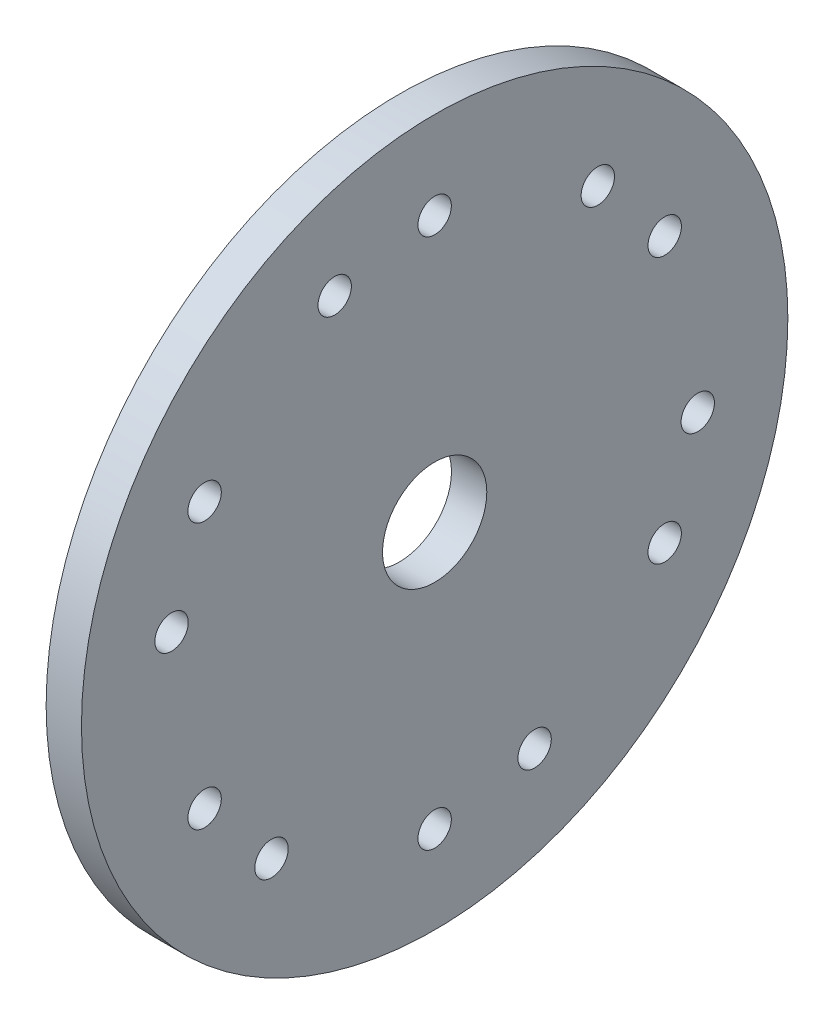
ISO-10303-21;
HEADER;
FILE_DESCRIPTION(('STEP AP214'),'2;1');
FILE_NAME('part.step','',(''),(''),'','','');
FILE_SCHEMA(('AUTOMOTIVE_DESIGN { 1 0 10303 214 1 1 1 1 }'));
ENDSEC;
DATA;
#1=APPLICATION_CONTEXT('core data for automotive mechanical design processes');
#2=APPLICATION_PROTOCOL_DEFINITION('international standard','automotive_design',2000,#1);
#3=PRODUCT_CONTEXT('',#1,'mechanical');
#4=PRODUCT('Part','Part','',(#3));
#5=PRODUCT_RELATED_PRODUCT_CATEGORY('part','',(#4));
#6=PRODUCT_DEFINITION_FORMATION('','',#4);
#7=PRODUCT_DEFINITION_CONTEXT('part definition',#1,'design');
#8=PRODUCT_DEFINITION('design','',#6,#7);
#9=PRODUCT_DEFINITION_SHAPE('','',#8);
#10=(LENGTH_UNIT() NAMED_UNIT(*) SI_UNIT(.MILLI.,.METRE.));
#11=(NAMED_UNIT(*) PLANE_ANGLE_UNIT() SI_UNIT($,.RADIAN.));
#12=(NAMED_UNIT(*) SI_UNIT($,.STERADIAN.) SOLID_ANGLE_UNIT());
#13=UNCERTAINTY_MEASURE_WITH_UNIT(LENGTH_MEASURE(1.E-05),#10,'distance_accuracy_value','');
#14=(GEOMETRIC_REPRESENTATION_CONTEXT(3) GLOBAL_UNCERTAINTY_ASSIGNED_CONTEXT((#13)) GLOBAL_UNIT_ASSIGNED_CONTEXT((#10,
#11,#12)) REPRESENTATION_CONTEXT('',''));
#15=CARTESIAN_POINT('',(0.,0.,0.));
#16=DIRECTION('',(0.,0.,1.));
#17=DIRECTION('',(1.,0.,0.));
#18=AXIS2_PLACEMENT_3D('',#15,#16,#17);
#19=CARTESIAN_POINT('',(3.40414777600784,51.1989186374219,0.));
#20=DIRECTION('',(-1.,0.,0.));
#21=DIRECTION('',(0.,0.,1.));
#22=AXIS2_PLACEMENT_3D('',#19,#20,#21);
#23=CYLINDRICAL_SURFACE('',#22,3.21651758362946);
#24=CARTESIAN_POINT('',(3.40414777600784,51.1989186374219,0.));
#25=DIRECTION('',(1.,0.,0.));
#26=DIRECTION('',(0.,0.,-1.));
#27=AXIS2_PLACEMENT_3D('',#24,#25,#26);
#28=CIRCLE('',#27,3.21651758362946);
#29=CARTESIAN_POINT('',(3.40414777600784,51.1989186374219,-3.21651758362946));
#30=VERTEX_POINT('',#29);
#31=EDGE_CURVE('E57',#30,#30,#28,.T.);
#32=ORIENTED_EDGE('',*,*,#31,.T.);
#33=EDGE_LOOP('',(#32));
#34=FACE_BOUND('',#33,.T.);
#35=CARTESIAN_POINT('',(-3.40414777600784,51.1989186374219,0.));
#36=DIRECTION('',(1.,0.,0.));
#37=DIRECTION('',(0.,0.,-1.));
#38=AXIS2_PLACEMENT_3D('',#35,#36,#37);
#39=CIRCLE('',#38,3.21651758362946);
#40=CARTESIAN_POINT('',(-3.40414777600784,51.1989186374219,-3.21651758362946));
#41=VERTEX_POINT('',#40);
#42=EDGE_CURVE('E99',#41,#41,#39,.T.);
#43=ORIENTED_EDGE('',*,*,#42,.F.);
#44=EDGE_LOOP('',(#43));
#45=FACE_BOUND('',#44,.T.);
#46=ADVANCED_FACE('F49',(#34,#45),#23,.F.);
#47=CARTESIAN_POINT('',(3.40414777600784,40.4044126332726,-31.4453924987682));
#48=DIRECTION('',(-1.,0.,0.));
#49=DIRECTION('',(0.,0.,1.));
#50=AXIS2_PLACEMENT_3D('',#47,#48,#49);
#51=CYLINDRICAL_SURFACE('',#50,3.21651758362946);
#52=CARTESIAN_POINT('',(3.40414777600784,40.4044126332726,-31.4453924987682));
#53=DIRECTION('',(1.,0.,0.));
#54=DIRECTION('',(0.,0.,-1.));
#55=AXIS2_PLACEMENT_3D('',#52,#53,#54);
#56=CIRCLE('',#55,3.21651758362946);
#57=CARTESIAN_POINT('',(3.40414777600784,40.4044126332726,-34.6619100823976));
#58=VERTEX_POINT('',#57);
#59=EDGE_CURVE('E62',#58,#58,#56,.T.);
#60=ORIENTED_EDGE('',*,*,#59,.T.);
#61=EDGE_LOOP('',(#60));
#62=FACE_BOUND('',#61,.T.);
#63=CARTESIAN_POINT('',(-3.40414777600784,40.4044126332726,-31.4453924987682));
#64=DIRECTION('',(1.,0.,0.));
#65=DIRECTION('',(0.,0.,-1.));
#66=AXIS2_PLACEMENT_3D('',#63,#64,#65);
#67=CIRCLE('',#66,3.21651758362946);
#68=CARTESIAN_POINT('',(-3.40414777600784,40.4044126332726,-34.6619100823976));
#69=VERTEX_POINT('',#68);
#70=EDGE_CURVE('E97',#69,#69,#67,.T.);
#71=ORIENTED_EDGE('',*,*,#70,.F.);
#72=EDGE_LOOP('',(#71));
#73=FACE_BOUND('',#72,.T.);
#74=ADVANCED_FACE('F143',(#62,#73),#51,.F.);
#75=CARTESIAN_POINT('',(3.40414777600784,-7.03030241926968,-50.7139440147871));
#76=DIRECTION('',(-1.,0.,0.));
#77=DIRECTION('',(0.,0.,1.));
#78=AXIS2_PLACEMENT_3D('',#75,#76,#77);
#79=CYLINDRICAL_SURFACE('',#78,3.21651758362945);
#80=CARTESIAN_POINT('',(3.40414777600784,-7.03030241926968,-50.7139440147871));
#81=DIRECTION('',(1.,0.,0.));
#82=DIRECTION('',(0.,0.,-1.));
#83=AXIS2_PLACEMENT_3D('',#80,#81,#82);
#84=CIRCLE('',#83,3.21651758362945);
#85=CARTESIAN_POINT('',(3.40414777600784,-7.03030241926968,-53.9304615984165));
#86=VERTEX_POINT('',#85);
#87=EDGE_CURVE('E138',#86,#86,#84,.T.);
#88=ORIENTED_EDGE('',*,*,#87,.T.);
#89=EDGE_LOOP('',(#88));
#90=FACE_BOUND('',#89,.T.);
#91=CARTESIAN_POINT('',(-3.40414777600784,-7.03030241926968,-50.7139440147871));
#92=DIRECTION('',(1.,0.,0.));
#93=DIRECTION('',(0.,0.,-1.));
#94=AXIS2_PLACEMENT_3D('',#91,#92,#93);
#95=CIRCLE('',#94,3.21651758362945);
#96=CARTESIAN_POINT('',(-3.40414777600784,-7.03030241926968,-53.9304615984165));
#97=VERTEX_POINT('',#96);
#98=EDGE_CURVE('E94',#97,#97,#95,.T.);
#99=ORIENTED_EDGE('',*,*,#98,.F.);
#100=EDGE_LOOP('',(#99));
#101=FACE_BOUND('',#100,.T.);
#102=ADVANCED_FACE('F179',(#90,#101),#79,.F.);
#103=CARTESIAN_POINT('',(3.40414777600784,25.5994593187108,-44.3395641863));
#104=DIRECTION('',(-1.,0.,0.));
#105=DIRECTION('',(0.,0.,1.));
#106=AXIS2_PLACEMENT_3D('',#103,#104,#105);
#107=CYLINDRICAL_SURFACE('',#106,3.21651758362946);
#108=CARTESIAN_POINT('',(3.40414777600784,25.5994593187108,-44.3395641863));
#109=DIRECTION('',(1.,0.,0.));
#110=DIRECTION('',(0.,0.,-1.));
#111=AXIS2_PLACEMENT_3D('',#108,#109,#110);
#112=CIRCLE('',#111,3.21651758362946);
#113=CARTESIAN_POINT('',(3.40414777600784,25.5994593187108,-47.5560817699294));
#114=VERTEX_POINT('',#113);
#115=EDGE_CURVE('E135',#114,#114,#112,.T.);
#116=ORIENTED_EDGE('',*,*,#115,.T.);
#117=EDGE_LOOP('',(#116));
#118=FACE_BOUND('',#117,.T.);
#119=CARTESIAN_POINT('',(-3.40414777600784,25.5994593187108,-44.3395641863));
#120=DIRECTION('',(1.,0.,0.));
#121=DIRECTION('',(0.,0.,-1.));
#122=AXIS2_PLACEMENT_3D('',#119,#120,#121);
#123=CIRCLE('',#122,3.21651758362946);
#124=CARTESIAN_POINT('',(-3.40414777600784,25.5994593187108,-47.5560817699294));
#125=VERTEX_POINT('',#124);
#126=EDGE_CURVE('E91',#125,#125,#123,.T.);
#127=ORIENTED_EDGE('',*,*,#126,.F.);
#128=EDGE_LOOP('',(#127));
#129=FACE_BOUND('',#128,.T.);
#130=ADVANCED_FACE('F185',(#118,#129),#107,.F.);
#131=CARTESIAN_POINT('',(3.40414777600784,-47.4347150525423,-19.2685515160187));
#132=DIRECTION('',(-1.,0.,0.));
#133=DIRECTION('',(0.,0.,1.));
#134=AXIS2_PLACEMENT_3D('',#131,#132,#133);
#135=CYLINDRICAL_SURFACE('',#134,3.21651758362946);
#136=CARTESIAN_POINT('',(3.40414777600784,-47.4347150525423,-19.2685515160187));
#137=DIRECTION('',(1.,0.,0.));
#138=DIRECTION('',(0.,0.,-1.));
#139=AXIS2_PLACEMENT_3D('',#136,#137,#138);
#140=CIRCLE('',#139,3.21651758362946);
#141=CARTESIAN_POINT('',(3.40414777600784,-47.4347150525423,-22.4850690996481));
#142=VERTEX_POINT('',#141);
#143=EDGE_CURVE('E132',#142,#142,#140,.T.);
#144=ORIENTED_EDGE('',*,*,#143,.T.);
#145=EDGE_LOOP('',(#144));
#146=FACE_BOUND('',#145,.T.);
#147=CARTESIAN_POINT('',(-3.40414777600784,-47.4347150525423,-19.2685515160187));
#148=DIRECTION('',(1.,0.,0.));
#149=DIRECTION('',(0.,0.,-1.));
#150=AXIS2_PLACEMENT_3D('',#147,#148,#149);
#151=CIRCLE('',#150,3.21651758362946);
#152=CARTESIAN_POINT('',(-3.40414777600784,-47.4347150525423,-22.4850690996481));
#153=VERTEX_POINT('',#152);
#154=EDGE_CURVE('E88',#153,#153,#151,.T.);
#155=ORIENTED_EDGE('',*,*,#154,.F.);
#156=EDGE_LOOP('',(#155));
#157=FACE_BOUND('',#156,.T.);
#158=ADVANCED_FACE('F189',(#146,#157),#135,.F.);
#159=CARTESIAN_POINT('',(3.40414777600784,-25.5994593187111,-44.3395641862998));
#160=DIRECTION('',(-1.,0.,0.));
#161=DIRECTION('',(0.,0.,1.));
#162=AXIS2_PLACEMENT_3D('',#159,#160,#161);
#163=CYLINDRICAL_SURFACE('',#162,3.21651758362946);
#164=CARTESIAN_POINT('',(3.40414777600784,-25.5994593187111,-44.3395641862998));
#165=DIRECTION('',(1.,0.,0.));
#166=DIRECTION('',(0.,0.,-1.));
#167=AXIS2_PLACEMENT_3D('',#164,#165,#166);
#168=CIRCLE('',#167,3.21651758362946);
#169=CARTESIAN_POINT('',(3.40414777600784,-25.5994593187111,-47.5560817699292));
#170=VERTEX_POINT('',#169);
#171=EDGE_CURVE('E129',#170,#170,#168,.T.);
#172=ORIENTED_EDGE('',*,*,#171,.T.);
#173=EDGE_LOOP('',(#172));
#174=FACE_BOUND('',#173,.T.);
#175=CARTESIAN_POINT('',(-3.40414777600784,-25.5994593187111,-44.3395641862998));
#176=DIRECTION('',(1.,0.,0.));
#177=DIRECTION('',(0.,0.,-1.));
#178=AXIS2_PLACEMENT_3D('',#175,#176,#177);
#179=CIRCLE('',#178,3.21651758362946);
#180=CARTESIAN_POINT('',(-3.40414777600784,-25.5994593187111,-47.5560817699292));
#181=VERTEX_POINT('',#180);
#182=EDGE_CURVE('E85',#181,#181,#179,.T.);
#183=ORIENTED_EDGE('',*,*,#182,.F.);
#184=EDGE_LOOP('',(#183));
#185=FACE_BOUND('',#184,.T.);
#186=ADVANCED_FACE('F193',(#174,#185),#163,.F.);
#187=CARTESIAN_POINT('',(3.40414777600784,-40.4044126332724,31.4453924987685));
#188=DIRECTION('',(-1.,0.,0.));
#189=DIRECTION('',(0.,0.,1.));
#190=AXIS2_PLACEMENT_3D('',#187,#188,#189);
#191=CYLINDRICAL_SURFACE('',#190,3.21651758362946);
#192=CARTESIAN_POINT('',(3.40414777600784,-40.4044126332724,31.4453924987685));
#193=DIRECTION('',(1.,0.,0.));
#194=DIRECTION('',(0.,0.,-1.));
#195=AXIS2_PLACEMENT_3D('',#192,#193,#194);
#196=CIRCLE('',#195,3.21651758362946);
#197=CARTESIAN_POINT('',(3.40414777600784,-40.4044126332724,28.228874915139));
#198=VERTEX_POINT('',#197);
#199=EDGE_CURVE('E126',#198,#198,#196,.T.);
#200=ORIENTED_EDGE('',*,*,#199,.T.);
#201=EDGE_LOOP('',(#200));
#202=FACE_BOUND('',#201,.T.);
#203=CARTESIAN_POINT('',(-3.40414777600784,-40.4044126332724,31.4453924987685));
#204=DIRECTION('',(1.,0.,0.));
#205=DIRECTION('',(0.,0.,-1.));
#206=AXIS2_PLACEMENT_3D('',#203,#204,#205);
#207=CIRCLE('',#206,3.21651758362946);
#208=CARTESIAN_POINT('',(-3.40414777600784,-40.4044126332724,28.228874915139));
#209=VERTEX_POINT('',#208);
#210=EDGE_CURVE('E82',#209,#209,#207,.T.);
#211=ORIENTED_EDGE('',*,*,#210,.F.);
#212=EDGE_LOOP('',(#211));
#213=FACE_BOUND('',#212,.T.);
#214=ADVANCED_FACE('F197',(#202,#213),#191,.F.);
#215=CARTESIAN_POINT('',(3.40414777600784,-51.1989186374219,3.57520137983013E-13));
#216=DIRECTION('',(-1.,0.,0.));
#217=DIRECTION('',(0.,0.,1.));
#218=AXIS2_PLACEMENT_3D('',#215,#216,#217);
#219=CYLINDRICAL_SURFACE('',#218,3.21651758362946);
#220=CARTESIAN_POINT('',(3.40414777600784,-51.1989186374219,3.57520137983013E-13));
#221=DIRECTION('',(1.,0.,0.));
#222=DIRECTION('',(0.,0.,-1.));
#223=AXIS2_PLACEMENT_3D('',#220,#221,#222);
#224=CIRCLE('',#223,3.21651758362946);
#225=CARTESIAN_POINT('',(3.40414777600784,-51.1989186374219,-3.2165175836291));
#226=VERTEX_POINT('',#225);
#227=EDGE_CURVE('E123',#226,#226,#224,.T.);
#228=ORIENTED_EDGE('',*,*,#227,.T.);
#229=EDGE_LOOP('',(#228));
#230=FACE_BOUND('',#229,.T.);
#231=CARTESIAN_POINT('',(-3.40414777600784,-51.1989186374219,3.57520137983013E-13));
#232=DIRECTION('',(1.,0.,0.));
#233=DIRECTION('',(0.,0.,-1.));
#234=AXIS2_PLACEMENT_3D('',#231,#232,#233);
#235=CIRCLE('',#234,3.21651758362946);
#236=CARTESIAN_POINT('',(-3.40414777600784,-51.1989186374219,-3.2165175836291));
#237=VERTEX_POINT('',#236);
#238=EDGE_CURVE('E79',#237,#237,#235,.T.);
#239=ORIENTED_EDGE('',*,*,#238,.F.);
#240=EDGE_LOOP('',(#239));
#241=FACE_BOUND('',#240,.T.);
#242=ADVANCED_FACE('F201',(#230,#241),#219,.F.);
#243=CARTESIAN_POINT('',(3.40414777600784,7.03030241927002,50.713944014787));
#244=DIRECTION('',(-1.,0.,0.));
#245=DIRECTION('',(0.,0.,1.));
#246=AXIS2_PLACEMENT_3D('',#243,#244,#245);
#247=CYLINDRICAL_SURFACE('',#246,3.21651758362946);
#248=CARTESIAN_POINT('',(3.40414777600784,7.03030241927002,50.713944014787));
#249=DIRECTION('',(1.,0.,0.));
#250=DIRECTION('',(0.,0.,-1.));
#251=AXIS2_PLACEMENT_3D('',#248,#249,#250);
#252=CIRCLE('',#251,3.21651758362946);
#253=CARTESIAN_POINT('',(3.40414777600784,7.03030241927002,47.4974264311575));
#254=VERTEX_POINT('',#253);
#255=EDGE_CURVE('E120',#254,#254,#252,.T.);
#256=ORIENTED_EDGE('',*,*,#255,.T.);
#257=EDGE_LOOP('',(#256));
#258=FACE_BOUND('',#257,.T.);
#259=CARTESIAN_POINT('',(-3.40414777600784,7.03030241927002,50.713944014787));
#260=DIRECTION('',(1.,0.,0.));
#261=DIRECTION('',(0.,0.,-1.));
#262=AXIS2_PLACEMENT_3D('',#259,#260,#261);
#263=CIRCLE('',#262,3.21651758362946);
#264=CARTESIAN_POINT('',(-3.40414777600784,7.03030241927002,47.4974264311575));
#265=VERTEX_POINT('',#264);
#266=EDGE_CURVE('E76',#265,#265,#263,.T.);
#267=ORIENTED_EDGE('',*,*,#266,.F.);
#268=EDGE_LOOP('',(#267));
#269=FACE_BOUND('',#268,.T.);
#270=ADVANCED_FACE('F205',(#258,#269),#247,.F.);
#271=CARTESIAN_POINT('',(3.40414777600784,-25.5994593187105,44.3395641863001));
#272=DIRECTION('',(-1.,0.,0.));
#273=DIRECTION('',(0.,0.,1.));
#274=AXIS2_PLACEMENT_3D('',#271,#272,#273);
#275=CYLINDRICAL_SURFACE('',#274,3.21651758362946);
#276=CARTESIAN_POINT('',(3.40414777600784,-25.5994593187105,44.3395641863001));
#277=DIRECTION('',(1.,0.,0.));
#278=DIRECTION('',(0.,0.,-1.));
#279=AXIS2_PLACEMENT_3D('',#276,#277,#278);
#280=CIRCLE('',#279,3.21651758362946);
#281=CARTESIAN_POINT('',(3.40414777600784,-25.5994593187105,41.1230466026707));
#282=VERTEX_POINT('',#281);
#283=EDGE_CURVE('E113',#282,#282,#280,.T.);
#284=ORIENTED_EDGE('',*,*,#283,.T.);
#285=EDGE_LOOP('',(#284));
#286=FACE_BOUND('',#285,.T.);
#287=CARTESIAN_POINT('',(-3.40414777600784,-25.5994593187105,44.3395641863001));
#288=DIRECTION('',(1.,0.,0.));
#289=DIRECTION('',(0.,0.,-1.));
#290=AXIS2_PLACEMENT_3D('',#287,#288,#289);
#291=CIRCLE('',#290,3.21651758362946);
#292=CARTESIAN_POINT('',(-3.40414777600784,-25.5994593187105,41.1230466026707));
#293=VERTEX_POINT('',#292);
#294=EDGE_CURVE('E73',#293,#293,#291,.T.);
#295=ORIENTED_EDGE('',*,*,#294,.F.);
#296=EDGE_LOOP('',(#295));
#297=FACE_BOUND('',#296,.T.);
#298=ADVANCED_FACE('F209',(#286,#297),#275,.F.);
#299=CARTESIAN_POINT('',(3.40414777600784,47.4347150525424,19.2685515160184));
#300=DIRECTION('',(-1.,0.,0.));
#301=DIRECTION('',(0.,0.,1.));
#302=AXIS2_PLACEMENT_3D('',#299,#300,#301);
#303=CYLINDRICAL_SURFACE('',#302,3.21651758362945);
#304=CARTESIAN_POINT('',(3.40414777600784,47.4347150525424,19.2685515160184));
#305=DIRECTION('',(1.,0.,0.));
#306=DIRECTION('',(0.,0.,-1.));
#307=AXIS2_PLACEMENT_3D('',#304,#305,#306);
#308=CIRCLE('',#307,3.21651758362945);
#309=CARTESIAN_POINT('',(3.40414777600784,47.4347150525424,16.0520339323889));
#310=VERTEX_POINT('',#309);
#311=EDGE_CURVE('E108',#310,#310,#308,.T.);
#312=ORIENTED_EDGE('',*,*,#311,.T.);
#313=EDGE_LOOP('',(#312));
#314=FACE_BOUND('',#313,.T.);
#315=CARTESIAN_POINT('',(-3.40414777600784,47.4347150525424,19.2685515160184));
#316=DIRECTION('',(1.,0.,0.));
#317=DIRECTION('',(0.,0.,-1.));
#318=AXIS2_PLACEMENT_3D('',#315,#316,#317);
#319=CIRCLE('',#318,3.21651758362945);
#320=CARTESIAN_POINT('',(-3.40414777600784,47.4347150525424,16.0520339323889));
#321=VERTEX_POINT('',#320);
#322=EDGE_CURVE('E69',#321,#321,#319,.T.);
#323=ORIENTED_EDGE('',*,*,#322,.F.);
#324=EDGE_LOOP('',(#323));
#325=FACE_BOUND('',#324,.T.);
#326=ADVANCED_FACE('F212',(#314,#325),#303,.F.);
#327=CARTESIAN_POINT('',(3.40414777600784,25.5994593187115,44.3395641862996));
#328=DIRECTION('',(-1.,0.,0.));
#329=DIRECTION('',(0.,0.,1.));
#330=AXIS2_PLACEMENT_3D('',#327,#328,#329);
#331=CYLINDRICAL_SURFACE('',#330,3.21651758362946);
#332=CARTESIAN_POINT('',(3.40414777600784,25.5994593187115,44.3395641862996));
#333=DIRECTION('',(1.,0.,0.));
#334=DIRECTION('',(0.,0.,-1.));
#335=AXIS2_PLACEMENT_3D('',#332,#333,#334);
#336=CIRCLE('',#335,3.21651758362946);
#337=CARTESIAN_POINT('',(3.40414777600784,25.5994593187115,41.1230466026701));
#338=VERTEX_POINT('',#337);
#339=EDGE_CURVE('E104',#338,#338,#336,.T.);
#340=ORIENTED_EDGE('',*,*,#339,.T.);
#341=EDGE_LOOP('',(#340));
#342=FACE_BOUND('',#341,.T.);
#343=CARTESIAN_POINT('',(-3.40414777600784,25.5994593187115,44.3395641862996));
#344=DIRECTION('',(1.,0.,0.));
#345=DIRECTION('',(0.,0.,-1.));
#346=AXIS2_PLACEMENT_3D('',#343,#344,#345);
#347=CIRCLE('',#346,3.21651758362946);
#348=CARTESIAN_POINT('',(-3.40414777600784,25.5994593187115,41.1230466026701));
#349=VERTEX_POINT('',#348);
#350=EDGE_CURVE('E66',#349,#349,#347,.T.);
#351=ORIENTED_EDGE('',*,*,#350,.F.);
#352=EDGE_LOOP('',(#351));
#353=FACE_BOUND('',#352,.T.);
#354=ADVANCED_FACE('F51',(#342,#353),#331,.F.);
#355=CARTESIAN_POINT('',(3.40414777600784,0.,0.));
#356=DIRECTION('',(-1.,0.,0.));
#357=DIRECTION('',(0.,0.,1.));
#358=AXIS2_PLACEMENT_3D('',#355,#356,#357);
#359=CYLINDRICAL_SURFACE('',#358,68.0829555201568);
#360=CARTESIAN_POINT('',(3.40414777600784,0.,0.));
#361=DIRECTION('',(1.,0.,0.));
#362=DIRECTION('',(0.,0.,-1.));
#363=AXIS2_PLACEMENT_3D('',#360,#361,#362);
#364=CIRCLE('',#363,68.0829555201568);
#365=CARTESIAN_POINT('',(3.40414777600784,0.,-68.0829555201568));
#366=VERTEX_POINT('',#365);
#367=EDGE_CURVE('E10',#366,#366,#364,.T.);
#368=ORIENTED_EDGE('',*,*,#367,.F.);
#369=EDGE_LOOP('',(#368));
#370=FACE_BOUND('',#369,.T.);
#371=CARTESIAN_POINT('',(-3.40414777600784,0.,0.));
#372=DIRECTION('',(1.,0.,0.));
#373=DIRECTION('',(0.,0.,-1.));
#374=AXIS2_PLACEMENT_3D('',#371,#372,#373);
#375=CIRCLE('',#374,68.0829555201568);
#376=CARTESIAN_POINT('',(-3.40414777600784,0.,-68.0829555201568));
#377=VERTEX_POINT('',#376);
#378=EDGE_CURVE('E53',#377,#377,#375,.T.);
#379=ORIENTED_EDGE('',*,*,#378,.T.);
#380=EDGE_LOOP('',(#379));
#381=FACE_BOUND('',#380,.T.);
#382=ADVANCED_FACE('F150',(#370,#381),#359,.T.);
#383=CARTESIAN_POINT('',(3.40414777600784,0.,0.));
#384=DIRECTION('',(1.,0.,0.));
#385=DIRECTION('',(0.,0.,-1.));
#386=AXIS2_PLACEMENT_3D('',#383,#384,#385);
#387=PLANE('',#386);
#388=ORIENTED_EDGE('',*,*,#339,.F.);
#389=EDGE_LOOP('',(#388));
#390=FACE_BOUND('',#389,.T.);
#391=ORIENTED_EDGE('',*,*,#311,.F.);
#392=EDGE_LOOP('',(#391));
#393=FACE_BOUND('',#392,.T.);
#394=ORIENTED_EDGE('',*,*,#283,.F.);
#395=EDGE_LOOP('',(#394));
#396=FACE_BOUND('',#395,.T.);
#397=ORIENTED_EDGE('',*,*,#255,.F.);
#398=EDGE_LOOP('',(#397));
#399=FACE_BOUND('',#398,.T.);
#400=ORIENTED_EDGE('',*,*,#227,.F.);
#401=EDGE_LOOP('',(#400));
#402=FACE_BOUND('',#401,.T.);
#403=ORIENTED_EDGE('',*,*,#199,.F.);
#404=EDGE_LOOP('',(#403));
#405=FACE_BOUND('',#404,.T.);
#406=ORIENTED_EDGE('',*,*,#171,.F.);
#407=EDGE_LOOP('',(#406));
#408=FACE_BOUND('',#407,.T.);
#409=ORIENTED_EDGE('',*,*,#143,.F.);
#410=EDGE_LOOP('',(#409));
#411=FACE_BOUND('',#410,.T.);
#412=ORIENTED_EDGE('',*,*,#115,.F.);
#413=EDGE_LOOP('',(#412));
#414=FACE_BOUND('',#413,.T.);
#415=ORIENTED_EDGE('',*,*,#87,.F.);
#416=EDGE_LOOP('',(#415));
#417=FACE_BOUND('',#416,.T.);
#418=ORIENTED_EDGE('',*,*,#59,.F.);
#419=EDGE_LOOP('',(#418));
#420=FACE_BOUND('',#419,.T.);
#421=ORIENTED_EDGE('',*,*,#31,.F.);
#422=EDGE_LOOP('',(#421));
#423=FACE_BOUND('',#422,.T.);
#424=ORIENTED_EDGE('',*,*,#367,.T.);
#425=EDGE_LOOP('',(#424));
#426=FACE_BOUND('',#425,.T.);
#427=CARTESIAN_POINT('',(3.40414777600784,0.,0.));
#428=DIRECTION('',(1.,0.,0.));
#429=DIRECTION('',(0.,0.,-1.));
#430=AXIS2_PLACEMENT_3D('',#427,#428,#429);
#431=CIRCLE('',#430,10.05);
#432=CARTESIAN_POINT('',(3.40414777600784,0.,-10.05));
#433=VERTEX_POINT('',#432);
#434=EDGE_CURVE('E157',#433,#433,#431,.T.);
#435=ORIENTED_EDGE('',*,*,#434,.F.);
#436=EDGE_LOOP('',(#435));
#437=FACE_BOUND('',#436,.T.);
#438=ADVANCED_FACE('F146',(#390,#393,#396,#399,#402,#405,#408,#411,#414,#417,#420,#423,#426,
#437),#387,.T.);
#439=CARTESIAN_POINT('',(-3.40414777600784,0.,0.));
#440=DIRECTION('',(1.,0.,0.));
#441=DIRECTION('',(0.,0.,-1.));
#442=AXIS2_PLACEMENT_3D('',#439,#440,#441);
#443=PLANE('',#442);
#444=ORIENTED_EDGE('',*,*,#350,.T.);
#445=EDGE_LOOP('',(#444));
#446=FACE_BOUND('',#445,.T.);
#447=ORIENTED_EDGE('',*,*,#322,.T.);
#448=EDGE_LOOP('',(#447));
#449=FACE_BOUND('',#448,.T.);
#450=ORIENTED_EDGE('',*,*,#294,.T.);
#451=EDGE_LOOP('',(#450));
#452=FACE_BOUND('',#451,.T.);
#453=ORIENTED_EDGE('',*,*,#266,.T.);
#454=EDGE_LOOP('',(#453));
#455=FACE_BOUND('',#454,.T.);
#456=ORIENTED_EDGE('',*,*,#238,.T.);
#457=EDGE_LOOP('',(#456));
#458=FACE_BOUND('',#457,.T.);
#459=ORIENTED_EDGE('',*,*,#210,.T.);
#460=EDGE_LOOP('',(#459));
#461=FACE_BOUND('',#460,.T.);
#462=ORIENTED_EDGE('',*,*,#182,.T.);
#463=EDGE_LOOP('',(#462));
#464=FACE_BOUND('',#463,.T.);
#465=ORIENTED_EDGE('',*,*,#154,.T.);
#466=EDGE_LOOP('',(#465));
#467=FACE_BOUND('',#466,.T.);
#468=ORIENTED_EDGE('',*,*,#126,.T.);
#469=EDGE_LOOP('',(#468));
#470=FACE_BOUND('',#469,.T.);
#471=ORIENTED_EDGE('',*,*,#98,.T.);
#472=EDGE_LOOP('',(#471));
#473=FACE_BOUND('',#472,.T.);
#474=ORIENTED_EDGE('',*,*,#70,.T.);
#475=EDGE_LOOP('',(#474));
#476=FACE_BOUND('',#475,.T.);
#477=ORIENTED_EDGE('',*,*,#42,.T.);
#478=EDGE_LOOP('',(#477));
#479=FACE_BOUND('',#478,.T.);
#480=ORIENTED_EDGE('',*,*,#378,.F.);
#481=EDGE_LOOP('',(#480));
#482=FACE_BOUND('',#481,.T.);
#483=CARTESIAN_POINT('',(-3.40414777600784,0.,0.));
#484=DIRECTION('',(1.,0.,0.));
#485=DIRECTION('',(0.,0.,-1.));
#486=AXIS2_PLACEMENT_3D('',#483,#484,#485);
#487=CIRCLE('',#486,10.05);
#488=CARTESIAN_POINT('',(-3.40414777600784,0.,-10.05));
#489=VERTEX_POINT('',#488);
#490=EDGE_CURVE('E70',#489,#489,#487,.F.);
#491=ORIENTED_EDGE('',*,*,#490,.F.);
#492=EDGE_LOOP('',(#491));
#493=FACE_BOUND('',#492,.T.);
#494=ADVANCED_FACE('F149',(#446,#449,#452,#455,#458,#461,#464,#467,#470,#473,#476,#479,#482,
#493),#443,.F.);
#495=CARTESIAN_POINT('',(-46.0426866815567,0.,0.));
#496=DIRECTION('',(1.,0.,0.));
#497=DIRECTION('',(0.,0.,-1.));
#498=AXIS2_PLACEMENT_3D('',#495,#496,#497);
#499=CYLINDRICAL_SURFACE('',#498,10.05);
#500=ORIENTED_EDGE('',*,*,#490,.T.);
#501=EDGE_LOOP('',(#500));
#502=FACE_BOUND('',#501,.T.);
#503=ORIENTED_EDGE('',*,*,#434,.T.);
#504=EDGE_LOOP('',(#503));
#505=FACE_BOUND('',#504,.T.);
#506=ADVANCED_FACE('F162',(#502,#505),#499,.F.);
#507=CLOSED_SHELL('',(#46,#74,#102,#130,#158,#186,#214,#242,#270,#298,#326,#354,#382,#438,#494,#506));
#508=MANIFOLD_SOLID_BREP('B2',#507);
#509=ADVANCED_BREP_SHAPE_REPRESENTATION('',(#18,#508),#14);
#510=SHAPE_DEFINITION_REPRESENTATION(#9,#509);
ENDSEC;
END-ISO-10303-21;
